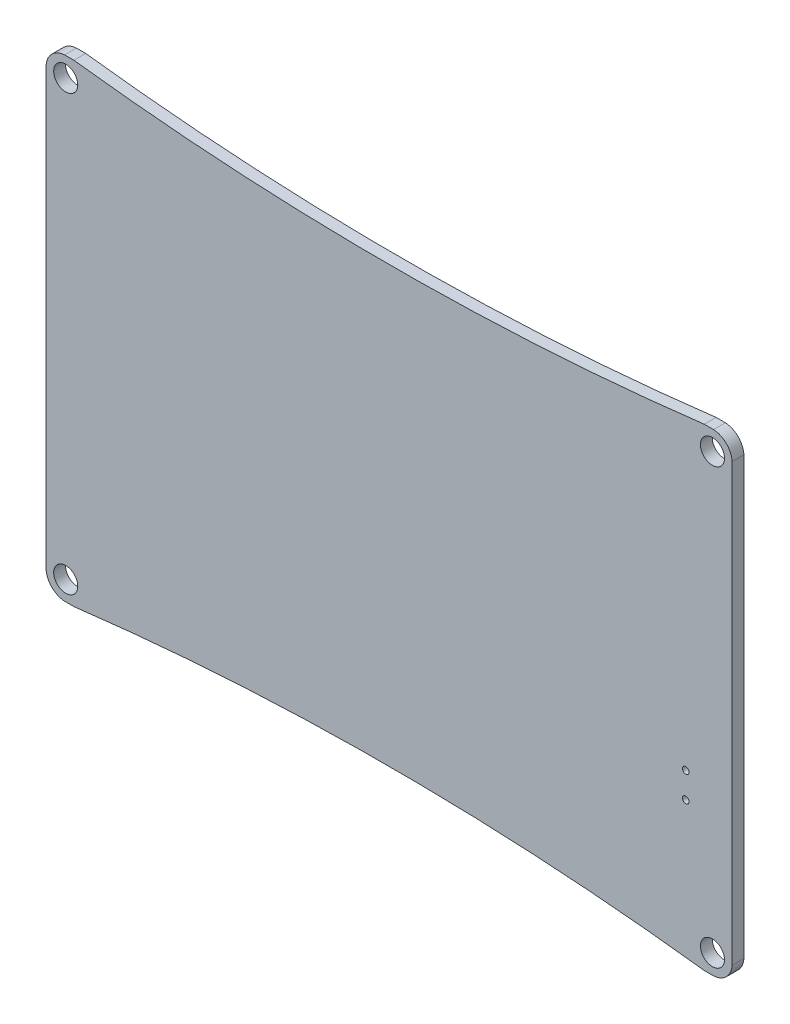
ISO-10303-21;
HEADER;
FILE_DESCRIPTION(('STEP AP214'),'2;1');
FILE_NAME('part.step','',(''),(''),'','','');
FILE_SCHEMA(('AUTOMOTIVE_DESIGN { 1 0 10303 214 1 1 1 1 }'));
ENDSEC;
DATA;
#1=APPLICATION_CONTEXT('core data for automotive mechanical design processes');
#2=APPLICATION_PROTOCOL_DEFINITION('international standard','automotive_design',2000,#1);
#3=PRODUCT_CONTEXT('',#1,'mechanical');
#4=PRODUCT('Part','Part','',(#3));
#5=PRODUCT_RELATED_PRODUCT_CATEGORY('part','',(#4));
#6=PRODUCT_DEFINITION_FORMATION('','',#4);
#7=PRODUCT_DEFINITION_CONTEXT('part definition',#1,'design');
#8=PRODUCT_DEFINITION('design','',#6,#7);
#9=PRODUCT_DEFINITION_SHAPE('','',#8);
#10=(LENGTH_UNIT() NAMED_UNIT(*) SI_UNIT(.MILLI.,.METRE.));
#11=(NAMED_UNIT(*) PLANE_ANGLE_UNIT() SI_UNIT($,.RADIAN.));
#12=(NAMED_UNIT(*) SI_UNIT($,.STERADIAN.) SOLID_ANGLE_UNIT());
#13=UNCERTAINTY_MEASURE_WITH_UNIT(LENGTH_MEASURE(1.E-05),#10,'distance_accuracy_value','');
#14=(GEOMETRIC_REPRESENTATION_CONTEXT(3) GLOBAL_UNCERTAINTY_ASSIGNED_CONTEXT((#13)) GLOBAL_UNIT_ASSIGNED_CONTEXT((#10,
#11,#12)) REPRESENTATION_CONTEXT('',''));
#15=CARTESIAN_POINT('',(0.,0.,0.));
#16=DIRECTION('',(0.,0.,1.));
#17=DIRECTION('',(1.,0.,0.));
#18=AXIS2_PLACEMENT_3D('',#15,#16,#17);
#19=CARTESIAN_POINT('',(5.22047789383308,62.7495221061669,1.62));
#20=DIRECTION('',(0.,0.,1.));
#21=DIRECTION('',(1.,0.,0.));
#22=AXIS2_PLACEMENT_3D('',#19,#20,#21);
#23=PLANE('',#22);
#24=CARTESIAN_POINT('',(5.23,62.76,1.62));
#25=DIRECTION('',(0.,0.,1.));
#26=DIRECTION('',(1.,0.,0.));
#27=AXIS2_PLACEMENT_3D('',#24,#25,#26);
#28=CIRCLE('',#27,1.65);
#29=CARTESIAN_POINT('',(6.88,62.76,1.62));
#30=VERTEX_POINT('',#29);
#31=EDGE_CURVE('E299',#30,#30,#28,.T.);
#32=ORIENTED_EDGE('',*,*,#31,.F.);
#33=EDGE_LOOP('',(#32));
#34=FACE_BOUND('',#33,.T.);
#35=CARTESIAN_POINT('',(93.83,3.28,1.62));
#36=DIRECTION('',(0.,0.,1.));
#37=DIRECTION('',(1.,0.,0.));
#38=AXIS2_PLACEMENT_3D('',#35,#36,#37);
#39=CIRCLE('',#38,1.65);
#40=CARTESIAN_POINT('',(95.48,3.28,1.62));
#41=VERTEX_POINT('',#40);
#42=EDGE_CURVE('E311',#41,#41,#39,.T.);
#43=ORIENTED_EDGE('',*,*,#42,.F.);
#44=EDGE_LOOP('',(#43));
#45=FACE_BOUND('',#44,.T.);
#46=CARTESIAN_POINT('',(90.17,23.09,1.62));
#47=DIRECTION('',(0.,0.,1.));
#48=DIRECTION('',(1.,0.,0.));
#49=AXIS2_PLACEMENT_3D('',#46,#47,#48);
#50=CIRCLE('',#49,0.450000000000006);
#51=CARTESIAN_POINT('',(90.62,23.09,1.62));
#52=VERTEX_POINT('',#51);
#53=EDGE_CURVE('E157',#52,#52,#50,.T.);
#54=ORIENTED_EDGE('',*,*,#53,.F.);
#55=EDGE_LOOP('',(#54));
#56=FACE_BOUND('',#55,.T.);
#57=CARTESIAN_POINT('',(5.22047789383308,62.7495221061669,1.62));
#58=DIRECTION('',(0.,0.,1.));
#59=DIRECTION('',(1.,0.,0.));
#60=AXIS2_PLACEMENT_3D('',#57,#58,#59);
#61=CIRCLE('',#60,2.6841564369432);
#62=CARTESIAN_POINT('',(5.08,65.43,1.62));
#63=VERTEX_POINT('',#62);
#64=CARTESIAN_POINT('',(2.54,62.89,1.62));
#65=VERTEX_POINT('',#64);
#66=EDGE_CURVE('E176',#63,#65,#61,.T.);
#67=ORIENTED_EDGE('',*,*,#66,.T.);
#68=DIRECTION('',(0.,-1.,0.));
#69=VECTOR('',#68,1.);
#70=CARTESIAN_POINT('',(2.54,62.89,1.62));
#71=LINE('',#70,#69);
#72=CARTESIAN_POINT('',(2.54,3.15,1.62));
#73=VERTEX_POINT('',#72);
#74=EDGE_CURVE('E104',#65,#73,#71,.T.);
#75=ORIENTED_EDGE('',*,*,#74,.T.);
#76=CARTESIAN_POINT('',(5.22047789383307,3.29047789383307,1.62));
#77=DIRECTION('',(0.,0.,1.));
#78=DIRECTION('',(1.,0.,0.));
#79=AXIS2_PLACEMENT_3D('',#76,#77,#78);
#80=CIRCLE('',#79,2.68415643694319);
#81=CARTESIAN_POINT('',(5.08,0.61,1.62));
#82=VERTEX_POINT('',#81);
#83=EDGE_CURVE('E203',#73,#82,#80,.T.);
#84=ORIENTED_EDGE('',*,*,#83,.T.);
#85=DIRECTION('',(1.,0.,0.));
#86=VECTOR('',#85,1.);
#87=CARTESIAN_POINT('',(5.08,0.61,1.62));
#88=LINE('',#87,#86);
#89=CARTESIAN_POINT('',(6.35,0.61,1.62));
#90=VERTEX_POINT('',#89);
#91=EDGE_CURVE('E222',#82,#90,#88,.T.);
#92=ORIENTED_EDGE('',*,*,#91,.T.);
#93=CARTESIAN_POINT('',(49.53,-351.062878759943,1.62));
#94=DIRECTION('',(0.,0.,-1.));
#95=DIRECTION('',(-1.,0.,0.));
#96=AXIS2_PLACEMENT_3D('',#93,#94,#95);
#97=CIRCLE('',#96,354.313880698041);
#98=CARTESIAN_POINT('',(92.71,0.609999999999999,1.62));
#99=VERTEX_POINT('',#98);
#100=EDGE_CURVE('E219',#90,#99,#97,.T.);
#101=ORIENTED_EDGE('',*,*,#100,.T.);
#102=DIRECTION('',(1.,0.,0.));
#103=VECTOR('',#102,1.);
#104=CARTESIAN_POINT('',(92.71,0.61,1.62));
#105=LINE('',#104,#103);
#106=CARTESIAN_POINT('',(93.98,0.61,1.62));
#107=VERTEX_POINT('',#106);
#108=EDGE_CURVE('E221',#99,#107,#105,.T.);
#109=ORIENTED_EDGE('',*,*,#108,.T.);
#110=CARTESIAN_POINT('',(93.8395221061669,3.29047789383307,1.62));
#111=DIRECTION('',(0.,0.,1.));
#112=DIRECTION('',(1.,0.,0.));
#113=AXIS2_PLACEMENT_3D('',#110,#111,#112);
#114=CIRCLE('',#113,2.68415643694318);
#115=CARTESIAN_POINT('',(96.52,3.15,1.62));
#116=VERTEX_POINT('',#115);
#117=EDGE_CURVE('E224',#107,#116,#114,.T.);
#118=ORIENTED_EDGE('',*,*,#117,.T.);
#119=DIRECTION('',(0.,1.,0.));
#120=VECTOR('',#119,1.);
#121=CARTESIAN_POINT('',(96.52,3.15,1.62));
#122=LINE('',#121,#120);
#123=CARTESIAN_POINT('',(96.52,62.89,1.62));
#124=VERTEX_POINT('',#123);
#125=EDGE_CURVE('E230',#116,#124,#122,.T.);
#126=ORIENTED_EDGE('',*,*,#125,.T.);
#127=CARTESIAN_POINT('',(93.8395221061669,62.7495221061669,1.62));
#128=DIRECTION('',(0.,0.,1.));
#129=DIRECTION('',(1.,0.,0.));
#130=AXIS2_PLACEMENT_3D('',#127,#128,#129);
#131=CIRCLE('',#130,2.68415643694319);
#132=CARTESIAN_POINT('',(93.98,65.43,1.62));
#133=VERTEX_POINT('',#132);
#134=EDGE_CURVE('E135',#124,#133,#131,.T.);
#135=ORIENTED_EDGE('',*,*,#134,.T.);
#136=DIRECTION('',(-1.,0.,0.));
#137=VECTOR('',#136,1.);
#138=CARTESIAN_POINT('',(93.98,65.43,1.62));
#139=LINE('',#138,#137);
#140=CARTESIAN_POINT('',(92.71,65.43,1.62));
#141=VERTEX_POINT('',#140);
#142=EDGE_CURVE('E129',#133,#141,#139,.T.);
#143=ORIENTED_EDGE('',*,*,#142,.T.);
#144=CARTESIAN_POINT('',(49.53,417.102878759943,1.62));
#145=DIRECTION('',(0.,0.,-1.));
#146=DIRECTION('',(-1.,0.,0.));
#147=AXIS2_PLACEMENT_3D('',#144,#145,#146);
#148=CIRCLE('',#147,354.313880698041);
#149=CARTESIAN_POINT('',(6.35000000000023,65.43,1.62));
#150=VERTEX_POINT('',#149);
#151=EDGE_CURVE('E133',#141,#150,#148,.T.);
#152=ORIENTED_EDGE('',*,*,#151,.T.);
#153=DIRECTION('',(-1.,0.,0.));
#154=VECTOR('',#153,1.);
#155=CARTESIAN_POINT('',(6.35,65.43,1.62));
#156=LINE('',#155,#154);
#157=EDGE_CURVE('E49',#150,#63,#156,.T.);
#158=ORIENTED_EDGE('',*,*,#157,.T.);
#159=EDGE_LOOP('',(#67,#75,#84,#92,#101,#109,#118,#126,#135,#143,#152,#158));
#160=FACE_BOUND('',#159,.T.);
#161=CARTESIAN_POINT('',(90.17,19.59,1.62));
#162=DIRECTION('',(0.,0.,1.));
#163=DIRECTION('',(1.,0.,0.));
#164=AXIS2_PLACEMENT_3D('',#161,#162,#163);
#165=CIRCLE('',#164,0.450000000000006);
#166=CARTESIAN_POINT('',(90.62,19.59,1.62));
#167=VERTEX_POINT('',#166);
#168=EDGE_CURVE('E317',#167,#167,#165,.T.);
#169=ORIENTED_EDGE('',*,*,#168,.F.);
#170=EDGE_LOOP('',(#169));
#171=FACE_BOUND('',#170,.T.);
#172=CARTESIAN_POINT('',(5.23,3.28,1.62));
#173=DIRECTION('',(0.,0.,1.));
#174=DIRECTION('',(1.,0.,0.));
#175=AXIS2_PLACEMENT_3D('',#172,#173,#174);
#176=CIRCLE('',#175,1.65);
#177=CARTESIAN_POINT('',(6.88,3.28,1.62));
#178=VERTEX_POINT('',#177);
#179=EDGE_CURVE('E305',#178,#178,#176,.T.);
#180=ORIENTED_EDGE('',*,*,#179,.F.);
#181=EDGE_LOOP('',(#180));
#182=FACE_BOUND('',#181,.T.);
#183=CARTESIAN_POINT('',(93.83,62.76,1.62));
#184=DIRECTION('',(0.,0.,1.));
#185=DIRECTION('',(1.,0.,0.));
#186=AXIS2_PLACEMENT_3D('',#183,#184,#185);
#187=CIRCLE('',#186,1.65);
#188=CARTESIAN_POINT('',(95.48,62.76,1.62));
#189=VERTEX_POINT('',#188);
#190=EDGE_CURVE('E290',#189,#189,#187,.T.);
#191=ORIENTED_EDGE('',*,*,#190,.F.);
#192=EDGE_LOOP('',(#191));
#193=FACE_BOUND('',#192,.T.);
#194=ADVANCED_FACE('F32',(#34,#45,#56,#160,#171,#182,#193),#23,.T.);
#195=CARTESIAN_POINT('',(5.22047789383308,62.7495221061669,0.));
#196=DIRECTION('',(0.,0.,1.));
#197=DIRECTION('',(1.,0.,0.));
#198=AXIS2_PLACEMENT_3D('',#195,#196,#197);
#199=PLANE('',#198);
#200=CARTESIAN_POINT('',(5.23,62.76,0.));
#201=DIRECTION('',(0.,0.,1.));
#202=DIRECTION('',(1.,0.,0.));
#203=AXIS2_PLACEMENT_3D('',#200,#201,#202);
#204=CIRCLE('',#203,1.65);
#205=CARTESIAN_POINT('',(6.88,62.76,0.));
#206=VERTEX_POINT('',#205);
#207=EDGE_CURVE('E296',#206,#206,#204,.T.);
#208=ORIENTED_EDGE('',*,*,#207,.T.);
#209=EDGE_LOOP('',(#208));
#210=FACE_BOUND('',#209,.T.);
#211=CARTESIAN_POINT('',(93.83,3.28,0.));
#212=DIRECTION('',(0.,0.,1.));
#213=DIRECTION('',(1.,0.,0.));
#214=AXIS2_PLACEMENT_3D('',#211,#212,#213);
#215=CIRCLE('',#214,1.65);
#216=CARTESIAN_POINT('',(95.48,3.28,0.));
#217=VERTEX_POINT('',#216);
#218=EDGE_CURVE('E308',#217,#217,#215,.T.);
#219=ORIENTED_EDGE('',*,*,#218,.T.);
#220=EDGE_LOOP('',(#219));
#221=FACE_BOUND('',#220,.T.);
#222=CARTESIAN_POINT('',(90.17,23.09,0.));
#223=DIRECTION('',(0.,0.,1.));
#224=DIRECTION('',(1.,0.,0.));
#225=AXIS2_PLACEMENT_3D('',#222,#223,#224);
#226=CIRCLE('',#225,0.450000000000006);
#227=CARTESIAN_POINT('',(90.62,23.09,0.));
#228=VERTEX_POINT('',#227);
#229=EDGE_CURVE('E320',#228,#228,#226,.T.);
#230=ORIENTED_EDGE('',*,*,#229,.T.);
#231=EDGE_LOOP('',(#230));
#232=FACE_BOUND('',#231,.T.);
#233=CARTESIAN_POINT('',(5.22047789383308,62.7495221061669,0.));
#234=DIRECTION('',(0.,0.,1.));
#235=DIRECTION('',(1.,0.,0.));
#236=AXIS2_PLACEMENT_3D('',#233,#234,#235);
#237=CIRCLE('',#236,2.6841564369432);
#238=CARTESIAN_POINT('',(5.08,65.43,0.));
#239=VERTEX_POINT('',#238);
#240=CARTESIAN_POINT('',(2.54,62.89,0.));
#241=VERTEX_POINT('',#240);
#242=EDGE_CURVE('E153',#239,#241,#237,.T.);
#243=ORIENTED_EDGE('',*,*,#242,.F.);
#244=DIRECTION('',(-1.,0.,0.));
#245=VECTOR('',#244,1.);
#246=CARTESIAN_POINT('',(6.35,65.43,0.));
#247=LINE('',#246,#245);
#248=CARTESIAN_POINT('',(6.35000000000023,65.43,0.));
#249=VERTEX_POINT('',#248);
#250=EDGE_CURVE('E96',#249,#239,#247,.T.);
#251=ORIENTED_EDGE('',*,*,#250,.F.);
#252=CARTESIAN_POINT('',(49.53,417.102878759943,0.));
#253=DIRECTION('',(0.,0.,-1.));
#254=DIRECTION('',(-1.,0.,0.));
#255=AXIS2_PLACEMENT_3D('',#252,#253,#254);
#256=CIRCLE('',#255,354.313880698041);
#257=CARTESIAN_POINT('',(92.71,65.43,0.));
#258=VERTEX_POINT('',#257);
#259=EDGE_CURVE('E90',#258,#249,#256,.T.);
#260=ORIENTED_EDGE('',*,*,#259,.F.);
#261=DIRECTION('',(-1.,0.,0.));
#262=VECTOR('',#261,1.);
#263=CARTESIAN_POINT('',(93.98,65.43,0.));
#264=LINE('',#263,#262);
#265=CARTESIAN_POINT('',(93.98,65.43,0.));
#266=VERTEX_POINT('',#265);
#267=EDGE_CURVE('E143',#266,#258,#264,.T.);
#268=ORIENTED_EDGE('',*,*,#267,.F.);
#269=CARTESIAN_POINT('',(93.8395221061669,62.7495221061669,0.));
#270=DIRECTION('',(0.,0.,1.));
#271=DIRECTION('',(1.,0.,0.));
#272=AXIS2_PLACEMENT_3D('',#269,#270,#271);
#273=CIRCLE('',#272,2.68415643694319);
#274=CARTESIAN_POINT('',(96.52,62.89,0.));
#275=VERTEX_POINT('',#274);
#276=EDGE_CURVE('E171',#275,#266,#273,.T.);
#277=ORIENTED_EDGE('',*,*,#276,.F.);
#278=DIRECTION('',(0.,1.,0.));
#279=VECTOR('',#278,1.);
#280=CARTESIAN_POINT('',(96.52,3.15,0.));
#281=LINE('',#280,#279);
#282=CARTESIAN_POINT('',(96.52,3.15,0.));
#283=VERTEX_POINT('',#282);
#284=EDGE_CURVE('E169',#283,#275,#281,.T.);
#285=ORIENTED_EDGE('',*,*,#284,.F.);
#286=CARTESIAN_POINT('',(93.8395221061669,3.29047789383307,0.));
#287=DIRECTION('',(0.,0.,1.));
#288=DIRECTION('',(1.,0.,0.));
#289=AXIS2_PLACEMENT_3D('',#286,#287,#288);
#290=CIRCLE('',#289,2.68415643694318);
#291=CARTESIAN_POINT('',(93.98,0.61,0.));
#292=VERTEX_POINT('',#291);
#293=EDGE_CURVE('E167',#292,#283,#290,.T.);
#294=ORIENTED_EDGE('',*,*,#293,.F.);
#295=DIRECTION('',(1.,0.,0.));
#296=VECTOR('',#295,1.);
#297=CARTESIAN_POINT('',(92.71,0.61,0.));
#298=LINE('',#297,#296);
#299=CARTESIAN_POINT('',(92.71,0.609999999999999,0.));
#300=VERTEX_POINT('',#299);
#301=EDGE_CURVE('E165',#300,#292,#298,.T.);
#302=ORIENTED_EDGE('',*,*,#301,.F.);
#303=CARTESIAN_POINT('',(49.53,-351.062878759943,0.));
#304=DIRECTION('',(0.,0.,-1.));
#305=DIRECTION('',(-1.,0.,0.));
#306=AXIS2_PLACEMENT_3D('',#303,#304,#305);
#307=CIRCLE('',#306,354.313880698041);
#308=CARTESIAN_POINT('',(6.35,0.61,0.));
#309=VERTEX_POINT('',#308);
#310=EDGE_CURVE('E163',#309,#300,#307,.T.);
#311=ORIENTED_EDGE('',*,*,#310,.F.);
#312=DIRECTION('',(1.,0.,0.));
#313=VECTOR('',#312,1.);
#314=CARTESIAN_POINT('',(5.08,0.61,0.));
#315=LINE('',#314,#313);
#316=CARTESIAN_POINT('',(5.08,0.61,0.));
#317=VERTEX_POINT('',#316);
#318=EDGE_CURVE('E161',#317,#309,#315,.T.);
#319=ORIENTED_EDGE('',*,*,#318,.F.);
#320=CARTESIAN_POINT('',(5.22047789383307,3.29047789383307,0.));
#321=DIRECTION('',(0.,0.,1.));
#322=DIRECTION('',(1.,0.,0.));
#323=AXIS2_PLACEMENT_3D('',#320,#321,#322);
#324=CIRCLE('',#323,2.68415643694319);
#325=CARTESIAN_POINT('',(2.54,3.15,0.));
#326=VERTEX_POINT('',#325);
#327=EDGE_CURVE('E159',#326,#317,#324,.T.);
#328=ORIENTED_EDGE('',*,*,#327,.F.);
#329=DIRECTION('',(0.,-1.,0.));
#330=VECTOR('',#329,1.);
#331=CARTESIAN_POINT('',(2.54,62.89,0.));
#332=LINE('',#331,#330);
#333=EDGE_CURVE('E156',#241,#326,#332,.T.);
#334=ORIENTED_EDGE('',*,*,#333,.F.);
#335=EDGE_LOOP('',(#243,#251,#260,#268,#277,#285,#294,#302,#311,#319,#328,#334));
#336=FACE_BOUND('',#335,.T.);
#337=CARTESIAN_POINT('',(90.17,19.59,0.));
#338=DIRECTION('',(0.,0.,1.));
#339=DIRECTION('',(1.,0.,0.));
#340=AXIS2_PLACEMENT_3D('',#337,#338,#339);
#341=CIRCLE('',#340,0.450000000000006);
#342=CARTESIAN_POINT('',(90.62,19.59,0.));
#343=VERTEX_POINT('',#342);
#344=EDGE_CURVE('E314',#343,#343,#341,.T.);
#345=ORIENTED_EDGE('',*,*,#344,.T.);
#346=EDGE_LOOP('',(#345));
#347=FACE_BOUND('',#346,.T.);
#348=CARTESIAN_POINT('',(5.23,3.28,0.));
#349=DIRECTION('',(0.,0.,1.));
#350=DIRECTION('',(1.,0.,0.));
#351=AXIS2_PLACEMENT_3D('',#348,#349,#350);
#352=CIRCLE('',#351,1.65);
#353=CARTESIAN_POINT('',(6.88,3.28,0.));
#354=VERTEX_POINT('',#353);
#355=EDGE_CURVE('E302',#354,#354,#352,.T.);
#356=ORIENTED_EDGE('',*,*,#355,.T.);
#357=EDGE_LOOP('',(#356));
#358=FACE_BOUND('',#357,.T.);
#359=CARTESIAN_POINT('',(93.83,62.76,0.));
#360=DIRECTION('',(0.,0.,1.));
#361=DIRECTION('',(1.,0.,0.));
#362=AXIS2_PLACEMENT_3D('',#359,#360,#361);
#363=CIRCLE('',#362,1.65);
#364=CARTESIAN_POINT('',(95.48,62.76,0.));
#365=VERTEX_POINT('',#364);
#366=EDGE_CURVE('E293',#365,#365,#363,.T.);
#367=ORIENTED_EDGE('',*,*,#366,.T.);
#368=EDGE_LOOP('',(#367));
#369=FACE_BOUND('',#368,.T.);
#370=ADVANCED_FACE('F207',(#210,#221,#232,#336,#347,#358,#369),#199,.F.);
#371=CARTESIAN_POINT('',(5.22047789383308,62.7495221061669,1.62));
#372=DIRECTION('',(0.,0.,-1.));
#373=DIRECTION('',(-1.,0.,0.));
#374=AXIS2_PLACEMENT_3D('',#371,#372,#373);
#375=CYLINDRICAL_SURFACE('',#374,2.6841564369432);
#376=ORIENTED_EDGE('',*,*,#242,.T.);
#377=DIRECTION('',(0.,0.,-1.));
#378=VECTOR('',#377,1.);
#379=CARTESIAN_POINT('',(2.54,62.89,1.62));
#380=LINE('',#379,#378);
#381=EDGE_CURVE('E11',#65,#241,#380,.T.);
#382=ORIENTED_EDGE('',*,*,#381,.F.);
#383=ORIENTED_EDGE('',*,*,#66,.F.);
#384=DIRECTION('',(0.,0.,-1.));
#385=VECTOR('',#384,1.);
#386=CARTESIAN_POINT('',(5.08,65.43,1.62));
#387=LINE('',#386,#385);
#388=EDGE_CURVE('E149',#63,#239,#387,.T.);
#389=ORIENTED_EDGE('',*,*,#388,.T.);
#390=EDGE_LOOP('',(#376,#382,#383,#389));
#391=FACE_BOUND('',#390,.T.);
#392=ADVANCED_FACE('F34',(#391),#375,.T.);
#393=CARTESIAN_POINT('',(2.54,62.89,1.62));
#394=DIRECTION('',(1.,0.,0.));
#395=DIRECTION('',(0.,0.,-1.));
#396=AXIS2_PLACEMENT_3D('',#393,#394,#395);
#397=PLANE('',#396);
#398=ORIENTED_EDGE('',*,*,#333,.T.);
#399=DIRECTION('',(0.,0.,-1.));
#400=VECTOR('',#399,1.);
#401=CARTESIAN_POINT('',(2.54,3.15,1.62));
#402=LINE('',#401,#400);
#403=EDGE_CURVE('E41',#73,#326,#402,.T.);
#404=ORIENTED_EDGE('',*,*,#403,.F.);
#405=ORIENTED_EDGE('',*,*,#74,.F.);
#406=ORIENTED_EDGE('',*,*,#381,.T.);
#407=EDGE_LOOP('',(#398,#404,#405,#406));
#408=FACE_BOUND('',#407,.T.);
#409=ADVANCED_FACE('F448',(#408),#397,.F.);
#410=CARTESIAN_POINT('',(5.22047789383307,3.29047789383307,1.62));
#411=DIRECTION('',(0.,0.,-1.));
#412=DIRECTION('',(-1.,0.,0.));
#413=AXIS2_PLACEMENT_3D('',#410,#411,#412);
#414=CYLINDRICAL_SURFACE('',#413,2.68415643694319);
#415=ORIENTED_EDGE('',*,*,#327,.T.);
#416=DIRECTION('',(0.,0.,-1.));
#417=VECTOR('',#416,1.);
#418=CARTESIAN_POINT('',(5.08,0.61,1.62));
#419=LINE('',#418,#417);
#420=EDGE_CURVE('E195',#82,#317,#419,.T.);
#421=ORIENTED_EDGE('',*,*,#420,.F.);
#422=ORIENTED_EDGE('',*,*,#83,.F.);
#423=ORIENTED_EDGE('',*,*,#403,.T.);
#424=EDGE_LOOP('',(#415,#421,#422,#423));
#425=FACE_BOUND('',#424,.T.);
#426=ADVANCED_FACE('F201',(#425),#414,.T.);
#427=CARTESIAN_POINT('',(5.08,0.61,1.62));
#428=DIRECTION('',(0.,1.,0.));
#429=DIRECTION('',(0.,0.,1.));
#430=AXIS2_PLACEMENT_3D('',#427,#428,#429);
#431=PLANE('',#430);
#432=ORIENTED_EDGE('',*,*,#318,.T.);
#433=DIRECTION('',(0.,0.,-1.));
#434=VECTOR('',#433,1.);
#435=CARTESIAN_POINT('',(6.35,0.61,1.62));
#436=LINE('',#435,#434);
#437=EDGE_CURVE('E192',#90,#309,#436,.T.);
#438=ORIENTED_EDGE('',*,*,#437,.F.);
#439=ORIENTED_EDGE('',*,*,#91,.F.);
#440=ORIENTED_EDGE('',*,*,#420,.T.);
#441=EDGE_LOOP('',(#432,#438,#439,#440));
#442=FACE_BOUND('',#441,.T.);
#443=ADVANCED_FACE('F213',(#442),#431,.F.);
#444=CARTESIAN_POINT('',(49.53,-351.062878759943,1.62));
#445=DIRECTION('',(0.,0.,-1.));
#446=DIRECTION('',(-1.,0.,0.));
#447=AXIS2_PLACEMENT_3D('',#444,#445,#446);
#448=CYLINDRICAL_SURFACE('',#447,354.313880698041);
#449=ORIENTED_EDGE('',*,*,#310,.T.);
#450=DIRECTION('',(0.,0.,-1.));
#451=VECTOR('',#450,1.);
#452=CARTESIAN_POINT('',(92.71,0.609999999999999,1.62));
#453=LINE('',#452,#451);
#454=EDGE_CURVE('E189',#99,#300,#453,.T.);
#455=ORIENTED_EDGE('',*,*,#454,.F.);
#456=ORIENTED_EDGE('',*,*,#100,.F.);
#457=ORIENTED_EDGE('',*,*,#437,.T.);
#458=EDGE_LOOP('',(#449,#455,#456,#457));
#459=FACE_BOUND('',#458,.T.);
#460=ADVANCED_FACE('F217',(#459),#448,.F.);
#461=CARTESIAN_POINT('',(92.71,0.61,1.62));
#462=DIRECTION('',(0.,1.,0.));
#463=DIRECTION('',(0.,0.,1.));
#464=AXIS2_PLACEMENT_3D('',#461,#462,#463);
#465=PLANE('',#464);
#466=ORIENTED_EDGE('',*,*,#301,.T.);
#467=DIRECTION('',(0.,0.,-1.));
#468=VECTOR('',#467,1.);
#469=CARTESIAN_POINT('',(93.98,0.61,1.62));
#470=LINE('',#469,#468);
#471=EDGE_CURVE('E186',#107,#292,#470,.T.);
#472=ORIENTED_EDGE('',*,*,#471,.F.);
#473=ORIENTED_EDGE('',*,*,#108,.F.);
#474=ORIENTED_EDGE('',*,*,#454,.T.);
#475=EDGE_LOOP('',(#466,#472,#473,#474));
#476=FACE_BOUND('',#475,.T.);
#477=ADVANCED_FACE('F413',(#476),#465,.F.);
#478=CARTESIAN_POINT('',(93.8395221061669,3.29047789383307,1.62));
#479=DIRECTION('',(0.,0.,-1.));
#480=DIRECTION('',(-1.,0.,0.));
#481=AXIS2_PLACEMENT_3D('',#478,#479,#480);
#482=CYLINDRICAL_SURFACE('',#481,2.68415643694318);
#483=ORIENTED_EDGE('',*,*,#293,.T.);
#484=DIRECTION('',(0.,0.,-1.));
#485=VECTOR('',#484,1.);
#486=CARTESIAN_POINT('',(96.52,3.15,1.62));
#487=LINE('',#486,#485);
#488=EDGE_CURVE('E183',#116,#283,#487,.T.);
#489=ORIENTED_EDGE('',*,*,#488,.F.);
#490=ORIENTED_EDGE('',*,*,#117,.F.);
#491=ORIENTED_EDGE('',*,*,#471,.T.);
#492=EDGE_LOOP('',(#483,#489,#490,#491));
#493=FACE_BOUND('',#492,.T.);
#494=ADVANCED_FACE('F404',(#493),#482,.T.);
#495=CARTESIAN_POINT('',(96.52,3.15,1.62));
#496=DIRECTION('',(-1.,0.,0.));
#497=DIRECTION('',(0.,0.,1.));
#498=AXIS2_PLACEMENT_3D('',#495,#496,#497);
#499=PLANE('',#498);
#500=ORIENTED_EDGE('',*,*,#284,.T.);
#501=DIRECTION('',(0.,0.,-1.));
#502=VECTOR('',#501,1.);
#503=CARTESIAN_POINT('',(96.52,62.89,1.62));
#504=LINE('',#503,#502);
#505=EDGE_CURVE('E180',#124,#275,#504,.T.);
#506=ORIENTED_EDGE('',*,*,#505,.F.);
#507=ORIENTED_EDGE('',*,*,#125,.F.);
#508=ORIENTED_EDGE('',*,*,#488,.T.);
#509=EDGE_LOOP('',(#500,#506,#507,#508));
#510=FACE_BOUND('',#509,.T.);
#511=ADVANCED_FACE('F236',(#510),#499,.F.);
#512=CARTESIAN_POINT('',(93.8395221061669,62.7495221061669,1.62));
#513=DIRECTION('',(0.,0.,-1.));
#514=DIRECTION('',(-1.,0.,0.));
#515=AXIS2_PLACEMENT_3D('',#512,#513,#514);
#516=CYLINDRICAL_SURFACE('',#515,2.68415643694319);
#517=ORIENTED_EDGE('',*,*,#276,.T.);
#518=DIRECTION('',(0.,0.,-1.));
#519=VECTOR('',#518,1.);
#520=CARTESIAN_POINT('',(93.98,65.43,1.62));
#521=LINE('',#520,#519);
#522=EDGE_CURVE('E144',#133,#266,#521,.T.);
#523=ORIENTED_EDGE('',*,*,#522,.F.);
#524=ORIENTED_EDGE('',*,*,#134,.F.);
#525=ORIENTED_EDGE('',*,*,#505,.T.);
#526=EDGE_LOOP('',(#517,#523,#524,#525));
#527=FACE_BOUND('',#526,.T.);
#528=ADVANCED_FACE('F240',(#527),#516,.T.);
#529=CARTESIAN_POINT('',(93.98,65.43,1.62));
#530=DIRECTION('',(0.,-1.,0.));
#531=DIRECTION('',(0.,0.,-1.));
#532=AXIS2_PLACEMENT_3D('',#529,#530,#531);
#533=PLANE('',#532);
#534=ORIENTED_EDGE('',*,*,#267,.T.);
#535=DIRECTION('',(0.,0.,-1.));
#536=VECTOR('',#535,1.);
#537=CARTESIAN_POINT('',(92.71,65.43,1.62));
#538=LINE('',#537,#536);
#539=EDGE_CURVE('E140',#141,#258,#538,.T.);
#540=ORIENTED_EDGE('',*,*,#539,.F.);
#541=ORIENTED_EDGE('',*,*,#142,.F.);
#542=ORIENTED_EDGE('',*,*,#522,.T.);
#543=EDGE_LOOP('',(#534,#540,#541,#542));
#544=FACE_BOUND('',#543,.T.);
#545=ADVANCED_FACE('F141',(#544),#533,.F.);
#546=CARTESIAN_POINT('',(49.53,417.102878759943,1.62));
#547=DIRECTION('',(0.,0.,-1.));
#548=DIRECTION('',(-1.,0.,0.));
#549=AXIS2_PLACEMENT_3D('',#546,#547,#548);
#550=CYLINDRICAL_SURFACE('',#549,354.313880698041);
#551=ORIENTED_EDGE('',*,*,#259,.T.);
#552=DIRECTION('',(0.,0.,-1.));
#553=VECTOR('',#552,1.);
#554=CARTESIAN_POINT('',(6.35000000000023,65.43,1.62));
#555=LINE('',#554,#553);
#556=EDGE_CURVE('E145',#150,#249,#555,.T.);
#557=ORIENTED_EDGE('',*,*,#556,.F.);
#558=ORIENTED_EDGE('',*,*,#151,.F.);
#559=ORIENTED_EDGE('',*,*,#539,.T.);
#560=EDGE_LOOP('',(#551,#557,#558,#559));
#561=FACE_BOUND('',#560,.T.);
#562=ADVANCED_FACE('F147',(#561),#550,.F.);
#563=CARTESIAN_POINT('',(6.35,65.43,1.62));
#564=DIRECTION('',(0.,-1.,0.));
#565=DIRECTION('',(0.,0.,-1.));
#566=AXIS2_PLACEMENT_3D('',#563,#564,#565);
#567=PLANE('',#566);
#568=ORIENTED_EDGE('',*,*,#250,.T.);
#569=ORIENTED_EDGE('',*,*,#388,.F.);
#570=ORIENTED_EDGE('',*,*,#157,.F.);
#571=ORIENTED_EDGE('',*,*,#556,.T.);
#572=EDGE_LOOP('',(#568,#569,#570,#571));
#573=FACE_BOUND('',#572,.T.);
#574=ADVANCED_FACE('F244',(#573),#567,.F.);
#575=CARTESIAN_POINT('',(90.17,23.09,1.62));
#576=DIRECTION('',(0.,0.,-1.));
#577=DIRECTION('',(-1.,0.,0.));
#578=AXIS2_PLACEMENT_3D('',#575,#576,#577);
#579=CYLINDRICAL_SURFACE('',#578,0.450000000000006);
#580=ORIENTED_EDGE('',*,*,#53,.T.);
#581=EDGE_LOOP('',(#580));
#582=FACE_BOUND('',#581,.T.);
#583=ORIENTED_EDGE('',*,*,#229,.F.);
#584=EDGE_LOOP('',(#583));
#585=FACE_BOUND('',#584,.T.);
#586=ADVANCED_FACE('F246',(#582,#585),#579,.F.);
#587=CARTESIAN_POINT('',(90.17,19.59,1.62));
#588=DIRECTION('',(0.,0.,-1.));
#589=DIRECTION('',(-1.,0.,0.));
#590=AXIS2_PLACEMENT_3D('',#587,#588,#589);
#591=CYLINDRICAL_SURFACE('',#590,0.450000000000006);
#592=ORIENTED_EDGE('',*,*,#168,.T.);
#593=EDGE_LOOP('',(#592));
#594=FACE_BOUND('',#593,.T.);
#595=ORIENTED_EDGE('',*,*,#344,.F.);
#596=EDGE_LOOP('',(#595));
#597=FACE_BOUND('',#596,.T.);
#598=ADVANCED_FACE('F252',(#594,#597),#591,.F.);
#599=CARTESIAN_POINT('',(93.83,3.28,1.62));
#600=DIRECTION('',(0.,0.,-1.));
#601=DIRECTION('',(-1.,0.,0.));
#602=AXIS2_PLACEMENT_3D('',#599,#600,#601);
#603=CYLINDRICAL_SURFACE('',#602,1.65);
#604=ORIENTED_EDGE('',*,*,#42,.T.);
#605=EDGE_LOOP('',(#604));
#606=FACE_BOUND('',#605,.T.);
#607=ORIENTED_EDGE('',*,*,#218,.F.);
#608=EDGE_LOOP('',(#607));
#609=FACE_BOUND('',#608,.T.);
#610=ADVANCED_FACE('F269',(#606,#609),#603,.F.);
#611=CARTESIAN_POINT('',(5.23,3.28,1.62));
#612=DIRECTION('',(0.,0.,-1.));
#613=DIRECTION('',(-1.,0.,0.));
#614=AXIS2_PLACEMENT_3D('',#611,#612,#613);
#615=CYLINDRICAL_SURFACE('',#614,1.65);
#616=ORIENTED_EDGE('',*,*,#179,.T.);
#617=EDGE_LOOP('',(#616));
#618=FACE_BOUND('',#617,.T.);
#619=ORIENTED_EDGE('',*,*,#355,.F.);
#620=EDGE_LOOP('',(#619));
#621=FACE_BOUND('',#620,.T.);
#622=ADVANCED_FACE('F273',(#618,#621),#615,.F.);
#623=CARTESIAN_POINT('',(5.23,62.76,1.62));
#624=DIRECTION('',(0.,0.,-1.));
#625=DIRECTION('',(-1.,0.,0.));
#626=AXIS2_PLACEMENT_3D('',#623,#624,#625);
#627=CYLINDRICAL_SURFACE('',#626,1.65);
#628=ORIENTED_EDGE('',*,*,#31,.T.);
#629=EDGE_LOOP('',(#628));
#630=FACE_BOUND('',#629,.T.);
#631=ORIENTED_EDGE('',*,*,#207,.F.);
#632=EDGE_LOOP('',(#631));
#633=FACE_BOUND('',#632,.T.);
#634=ADVANCED_FACE('F277',(#630,#633),#627,.F.);
#635=CARTESIAN_POINT('',(93.83,62.76,1.62));
#636=DIRECTION('',(0.,0.,-1.));
#637=DIRECTION('',(-1.,0.,0.));
#638=AXIS2_PLACEMENT_3D('',#635,#636,#637);
#639=CYLINDRICAL_SURFACE('',#638,1.65);
#640=ORIENTED_EDGE('',*,*,#190,.T.);
#641=EDGE_LOOP('',(#640));
#642=FACE_BOUND('',#641,.T.);
#643=ORIENTED_EDGE('',*,*,#366,.F.);
#644=EDGE_LOOP('',(#643));
#645=FACE_BOUND('',#644,.T.);
#646=ADVANCED_FACE('F281',(#642,#645),#639,.F.);
#647=CLOSED_SHELL('',(#194,#370,#392,#409,#426,#443,#460,#477,#494,#511,#528,#545,#562,#574,
#586,#598,#610,#622,#634,#646));
#648=MANIFOLD_SOLID_BREP('B2',#647);
#649=ADVANCED_BREP_SHAPE_REPRESENTATION('',(#18,#648),#14);
#650=SHAPE_DEFINITION_REPRESENTATION(#9,#649);
ENDSEC;
END-ISO-10303-21;
